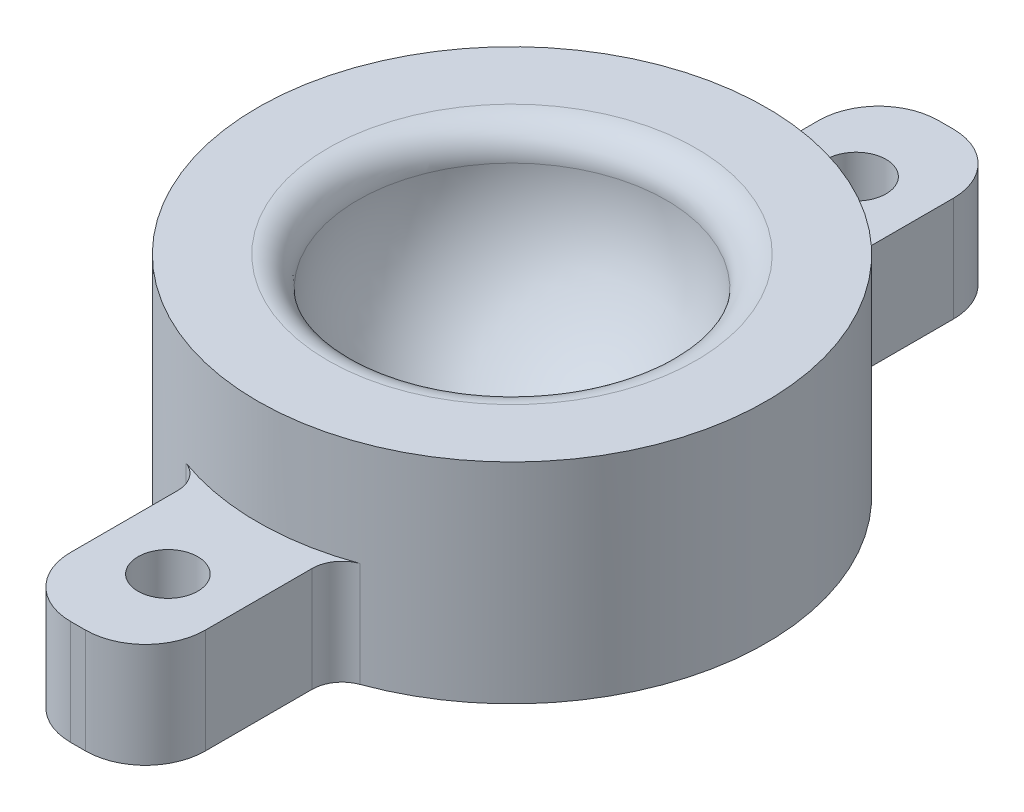
ISO-10303-21;
HEADER;
FILE_DESCRIPTION(('STEP AP214'),'2;1');
FILE_NAME('part.step','',(''),(''),'','','');
FILE_SCHEMA(('AUTOMOTIVE_DESIGN { 1 0 10303 214 1 1 1 1 }'));
ENDSEC;
DATA;
#1=APPLICATION_CONTEXT('core data for automotive mechanical design processes');
#2=APPLICATION_PROTOCOL_DEFINITION('international standard','automotive_design',2000,#1);
#3=PRODUCT_CONTEXT('',#1,'mechanical');
#4=PRODUCT('Part','Part','',(#3));
#5=PRODUCT_RELATED_PRODUCT_CATEGORY('part','',(#4));
#6=PRODUCT_DEFINITION_FORMATION('','',#4);
#7=PRODUCT_DEFINITION_CONTEXT('part definition',#1,'design');
#8=PRODUCT_DEFINITION('design','',#6,#7);
#9=PRODUCT_DEFINITION_SHAPE('','',#8);
#10=(LENGTH_UNIT() NAMED_UNIT(*) SI_UNIT(.MILLI.,.METRE.));
#11=(NAMED_UNIT(*) PLANE_ANGLE_UNIT() SI_UNIT($,.RADIAN.));
#12=(NAMED_UNIT(*) SI_UNIT($,.STERADIAN.) SOLID_ANGLE_UNIT());
#13=UNCERTAINTY_MEASURE_WITH_UNIT(LENGTH_MEASURE(1.E-05),#10,'distance_accuracy_value','');
#14=(GEOMETRIC_REPRESENTATION_CONTEXT(3) GLOBAL_UNCERTAINTY_ASSIGNED_CONTEXT((#13)) GLOBAL_UNIT_ASSIGNED_CONTEXT((#10,
#11,#12)) REPRESENTATION_CONTEXT('',''));
#15=CARTESIAN_POINT('',(0.,0.,0.));
#16=DIRECTION('',(0.,0.,1.));
#17=DIRECTION('',(1.,0.,0.));
#18=AXIS2_PLACEMENT_3D('',#15,#16,#17);
#19=CARTESIAN_POINT('',(0.,3.5,0.));
#20=DIRECTION('',(0.,1.,0.));
#21=DIRECTION('',(0.,0.,1.));
#22=AXIS2_PLACEMENT_3D('',#19,#20,#21);
#23=PLANE('',#22);
#24=CARTESIAN_POINT('',(0.,3.5,-11.5));
#25=DIRECTION('',(0.,1.,0.));
#26=DIRECTION('',(0.,0.,1.));
#27=AXIS2_PLACEMENT_3D('',#24,#25,#26);
#28=CIRCLE('',#27,1.);
#29=CARTESIAN_POINT('',(0.,3.5,-10.5));
#30=VERTEX_POINT('',#29);
#31=EDGE_CURVE('E202',#30,#30,#28,.T.);
#32=ORIENTED_EDGE('',*,*,#31,.F.);
#33=EDGE_LOOP('',(#32));
#34=FACE_BOUND('',#33,.T.);
#35=DIRECTION('',(0.,0.,-1.));
#36=VECTOR('',#35,1.);
#37=CARTESIAN_POINT('',(-2.25,3.5,0.));
#38=LINE('',#37,#36);
#39=CARTESIAN_POINT('',(-2.25,3.5,-8.92678553567856));
#40=VERTEX_POINT('',#39);
#41=CARTESIAN_POINT('',(-2.25,3.5,-12.5));
#42=VERTEX_POINT('',#41);
#43=EDGE_CURVE('E152',#40,#42,#38,.T.);
#44=ORIENTED_EDGE('',*,*,#43,.F.);
#45=CARTESIAN_POINT('',(-3.25,3.5,-8.92678553567856));
#46=DIRECTION('',(0.,1.,0.));
#47=DIRECTION('',(0.,0.,1.));
#48=AXIS2_PLACEMENT_3D('',#45,#46,#47);
#49=CIRCLE('',#48,1.);
#50=CARTESIAN_POINT('',(-2.90789473684211,3.5,-7.98712390034398));
#51=VERTEX_POINT('',#50);
#52=EDGE_CURVE('E289',#40,#51,#49,.F.);
#53=ORIENTED_EDGE('',*,*,#52,.T.);
#54=CARTESIAN_POINT('',(0.,3.5,0.));
#55=DIRECTION('',(0.,1.,0.));
#56=DIRECTION('',(0.,0.,1.));
#57=AXIS2_PLACEMENT_3D('',#54,#55,#56);
#58=CIRCLE('',#57,8.5);
#59=CARTESIAN_POINT('',(2.90789473684211,3.5,-7.98712390034398));
#60=VERTEX_POINT('',#59);
#61=EDGE_CURVE('E211',#51,#60,#58,.F.);
#62=ORIENTED_EDGE('',*,*,#61,.T.);
#63=CARTESIAN_POINT('',(3.25,3.5,-8.92678553567856));
#64=DIRECTION('',(0.,1.,0.));
#65=DIRECTION('',(0.,0.,1.));
#66=AXIS2_PLACEMENT_3D('',#63,#64,#65);
#67=CIRCLE('',#66,1.);
#68=CARTESIAN_POINT('',(2.25,3.5,-8.92678553567856));
#69=VERTEX_POINT('',#68);
#70=EDGE_CURVE('E277',#60,#69,#67,.F.);
#71=ORIENTED_EDGE('',*,*,#70,.T.);
#72=DIRECTION('',(0.,0.,1.));
#73=VECTOR('',#72,1.);
#74=CARTESIAN_POINT('',(2.25,3.5,0.));
#75=LINE('',#74,#73);
#76=CARTESIAN_POINT('',(2.25,3.5,-12.5));
#77=VERTEX_POINT('',#76);
#78=EDGE_CURVE('E195',#77,#69,#75,.T.);
#79=ORIENTED_EDGE('',*,*,#78,.F.);
#80=CARTESIAN_POINT('',(0.25,3.5,-12.5));
#81=DIRECTION('',(0.,1.,0.));
#82=DIRECTION('',(0.,0.,1.));
#83=AXIS2_PLACEMENT_3D('',#80,#81,#82);
#84=CIRCLE('',#83,2.);
#85=CARTESIAN_POINT('',(0.249999999999985,3.5,-14.5));
#86=VERTEX_POINT('',#85);
#87=EDGE_CURVE('E198',#86,#77,#84,.F.);
#88=ORIENTED_EDGE('',*,*,#87,.F.);
#89=DIRECTION('',(1.,0.,0.));
#90=VECTOR('',#89,1.);
#91=CARTESIAN_POINT('',(0.,3.5,-14.5));
#92=LINE('',#91,#90);
#93=CARTESIAN_POINT('',(-0.249999999999985,3.5,-14.5));
#94=VERTEX_POINT('',#93);
#95=EDGE_CURVE('E175',#94,#86,#92,.T.);
#96=ORIENTED_EDGE('',*,*,#95,.F.);
#97=CARTESIAN_POINT('',(-0.25,3.5,-12.5));
#98=DIRECTION('',(0.,1.,0.));
#99=DIRECTION('',(0.,0.,1.));
#100=AXIS2_PLACEMENT_3D('',#97,#98,#99);
#101=CIRCLE('',#100,2.);
#102=EDGE_CURVE('E162',#42,#94,#101,.F.);
#103=ORIENTED_EDGE('',*,*,#102,.F.);
#104=EDGE_LOOP('',(#44,#53,#62,#71,#79,#88,#96,#103));
#105=FACE_BOUND('',#104,.T.);
#106=ADVANCED_FACE('F41',(#34,#105),#23,.T.);
#107=CARTESIAN_POINT('',(-0.25,3.5,-12.5));
#108=DIRECTION('',(0.,-1.,0.));
#109=DIRECTION('',(0.,0.,-1.));
#110=AXIS2_PLACEMENT_3D('',#107,#108,#109);
#111=CYLINDRICAL_SURFACE('',#110,2.);
#112=CARTESIAN_POINT('',(-0.25,0.,-12.5));
#113=DIRECTION('',(0.,1.,0.));
#114=DIRECTION('',(0.,0.,1.));
#115=AXIS2_PLACEMENT_3D('',#112,#113,#114);
#116=CIRCLE('',#115,2.);
#117=CARTESIAN_POINT('',(-2.25,0.,-12.5));
#118=VERTEX_POINT('',#117);
#119=CARTESIAN_POINT('',(-0.249999999999985,0.,-14.5));
#120=VERTEX_POINT('',#119);
#121=EDGE_CURVE('E169',#118,#120,#116,.F.);
#122=ORIENTED_EDGE('',*,*,#121,.F.);
#123=DIRECTION('',(0.,-1.,0.));
#124=VECTOR('',#123,1.);
#125=CARTESIAN_POINT('',(-2.25,3.5,-12.5));
#126=LINE('',#125,#124);
#127=EDGE_CURVE('E155',#42,#118,#126,.T.);
#128=ORIENTED_EDGE('',*,*,#127,.F.);
#129=ORIENTED_EDGE('',*,*,#102,.T.);
#130=DIRECTION('',(0.,-1.,0.));
#131=VECTOR('',#130,1.);
#132=CARTESIAN_POINT('',(-0.249999999999985,3.5,-14.5));
#133=LINE('',#132,#131);
#134=EDGE_CURVE('E208',#94,#120,#133,.T.);
#135=ORIENTED_EDGE('',*,*,#134,.T.);
#136=EDGE_LOOP('',(#122,#128,#129,#135));
#137=FACE_BOUND('',#136,.T.);
#138=ADVANCED_FACE('F166',(#137),#111,.T.);
#139=CARTESIAN_POINT('',(-2.25,3.5,0.));
#140=DIRECTION('',(-1.,0.,0.));
#141=DIRECTION('',(0.,0.,1.));
#142=AXIS2_PLACEMENT_3D('',#139,#140,#141);
#143=PLANE('',#142);
#144=DIRECTION('',(0.,0.,-1.));
#145=VECTOR('',#144,1.);
#146=CARTESIAN_POINT('',(-2.25,0.,0.));
#147=LINE('',#146,#145);
#148=CARTESIAN_POINT('',(-2.25,0.,-8.92678553567856));
#149=VERTEX_POINT('',#148);
#150=EDGE_CURVE('E210',#149,#118,#147,.T.);
#151=ORIENTED_EDGE('',*,*,#150,.F.);
#152=DIRECTION('',(0.,-1.,0.));
#153=VECTOR('',#152,1.);
#154=CARTESIAN_POINT('',(-2.25,3.5,-8.92678553567856));
#155=LINE('',#154,#153);
#156=EDGE_CURVE('E56',#149,#40,#155,.F.);
#157=ORIENTED_EDGE('',*,*,#156,.T.);
#158=ORIENTED_EDGE('',*,*,#43,.T.);
#159=ORIENTED_EDGE('',*,*,#127,.T.);
#160=EDGE_LOOP('',(#151,#157,#158,#159));
#161=FACE_BOUND('',#160,.T.);
#162=ADVANCED_FACE('F154',(#161),#143,.T.);
#163=CARTESIAN_POINT('',(-2.25,3.5,0.));
#164=DIRECTION('',(1.,0.,0.));
#165=DIRECTION('',(0.,0.,-1.));
#166=AXIS2_PLACEMENT_3D('',#163,#164,#165);
#167=PLANE('',#166);
#168=DIRECTION('',(0.,0.,1.));
#169=VECTOR('',#168,1.);
#170=CARTESIAN_POINT('',(-2.25,3.5,0.));
#171=LINE('',#170,#169);
#172=CARTESIAN_POINT('',(-2.25,3.5,8.92678553567856));
#173=VERTEX_POINT('',#172);
#174=CARTESIAN_POINT('',(-2.25,3.5,12.5));
#175=VERTEX_POINT('',#174);
#176=EDGE_CURVE('E161',#173,#175,#171,.T.);
#177=ORIENTED_EDGE('',*,*,#176,.F.);
#178=DIRECTION('',(0.,1.,0.));
#179=VECTOR('',#178,1.);
#180=CARTESIAN_POINT('',(-2.25,0.,8.92678553567856));
#181=LINE('',#180,#179);
#182=CARTESIAN_POINT('',(-2.25,0.,8.92678553567856));
#183=VERTEX_POINT('',#182);
#184=EDGE_CURVE('E271',#173,#183,#181,.F.);
#185=ORIENTED_EDGE('',*,*,#184,.T.);
#186=DIRECTION('',(0.,0.,1.));
#187=VECTOR('',#186,1.);
#188=CARTESIAN_POINT('',(-2.25,0.,0.));
#189=LINE('',#188,#187);
#190=CARTESIAN_POINT('',(-2.25,0.,12.5));
#191=VERTEX_POINT('',#190);
#192=EDGE_CURVE('E216',#183,#191,#189,.T.);
#193=ORIENTED_EDGE('',*,*,#192,.T.);
#194=DIRECTION('',(0.,-1.,0.));
#195=VECTOR('',#194,1.);
#196=CARTESIAN_POINT('',(-2.25,3.5,12.5));
#197=LINE('',#196,#195);
#198=EDGE_CURVE('E171',#175,#191,#197,.T.);
#199=ORIENTED_EDGE('',*,*,#198,.F.);
#200=EDGE_LOOP('',(#177,#185,#193,#199));
#201=FACE_BOUND('',#200,.T.);
#202=ADVANCED_FACE('F374',(#201),#167,.F.);
#203=CARTESIAN_POINT('',(-0.25,3.5,12.5));
#204=DIRECTION('',(0.,-1.,0.));
#205=DIRECTION('',(0.,0.,-1.));
#206=AXIS2_PLACEMENT_3D('',#203,#204,#205);
#207=CYLINDRICAL_SURFACE('',#206,2.);
#208=CARTESIAN_POINT('',(-0.25,0.,12.5));
#209=DIRECTION('',(0.,1.,0.));
#210=DIRECTION('',(0.,0.,1.));
#211=AXIS2_PLACEMENT_3D('',#208,#209,#210);
#212=CIRCLE('',#211,2.);
#213=CARTESIAN_POINT('',(-0.249999999999985,0.,14.5));
#214=VERTEX_POINT('',#213);
#215=EDGE_CURVE('E219',#191,#214,#212,.T.);
#216=ORIENTED_EDGE('',*,*,#215,.T.);
#217=DIRECTION('',(0.,-1.,0.));
#218=VECTOR('',#217,1.);
#219=CARTESIAN_POINT('',(-0.249999999999985,3.5,14.5));
#220=LINE('',#219,#218);
#221=CARTESIAN_POINT('',(-0.249999999999985,3.5,14.5));
#222=VERTEX_POINT('',#221);
#223=EDGE_CURVE('E250',#222,#214,#220,.T.);
#224=ORIENTED_EDGE('',*,*,#223,.F.);
#225=CARTESIAN_POINT('',(-0.25,3.5,12.5));
#226=DIRECTION('',(0.,1.,0.));
#227=DIRECTION('',(0.,0.,1.));
#228=AXIS2_PLACEMENT_3D('',#225,#226,#227);
#229=CIRCLE('',#228,2.);
#230=EDGE_CURVE('E186',#175,#222,#229,.T.);
#231=ORIENTED_EDGE('',*,*,#230,.F.);
#232=ORIENTED_EDGE('',*,*,#198,.T.);
#233=EDGE_LOOP('',(#216,#224,#231,#232));
#234=FACE_BOUND('',#233,.T.);
#235=ADVANCED_FACE('F370',(#234),#207,.T.);
#236=CARTESIAN_POINT('',(0.,3.5,14.5));
#237=DIRECTION('',(0.,0.,-1.));
#238=DIRECTION('',(-1.,0.,0.));
#239=AXIS2_PLACEMENT_3D('',#236,#237,#238);
#240=PLANE('',#239);
#241=DIRECTION('',(1.,0.,0.));
#242=VECTOR('',#241,1.);
#243=CARTESIAN_POINT('',(0.,0.,14.5));
#244=LINE('',#243,#242);
#245=CARTESIAN_POINT('',(0.249999999999985,0.,14.5));
#246=VERTEX_POINT('',#245);
#247=EDGE_CURVE('E221',#214,#246,#244,.T.);
#248=ORIENTED_EDGE('',*,*,#247,.T.);
#249=DIRECTION('',(0.,-1.,0.));
#250=VECTOR('',#249,1.);
#251=CARTESIAN_POINT('',(0.249999999999985,3.5,14.5));
#252=LINE('',#251,#250);
#253=CARTESIAN_POINT('',(0.249999999999985,3.5,14.5));
#254=VERTEX_POINT('',#253);
#255=EDGE_CURVE('E247',#254,#246,#252,.T.);
#256=ORIENTED_EDGE('',*,*,#255,.F.);
#257=DIRECTION('',(1.,0.,0.));
#258=VECTOR('',#257,1.);
#259=CARTESIAN_POINT('',(0.,3.5,14.5));
#260=LINE('',#259,#258);
#261=EDGE_CURVE('E188',#222,#254,#260,.T.);
#262=ORIENTED_EDGE('',*,*,#261,.F.);
#263=ORIENTED_EDGE('',*,*,#223,.T.);
#264=EDGE_LOOP('',(#248,#256,#262,#263));
#265=FACE_BOUND('',#264,.T.);
#266=ADVANCED_FACE('F366',(#265),#240,.F.);
#267=CARTESIAN_POINT('',(0.25,3.5,12.5));
#268=DIRECTION('',(0.,-1.,0.));
#269=DIRECTION('',(0.,0.,-1.));
#270=AXIS2_PLACEMENT_3D('',#267,#268,#269);
#271=CYLINDRICAL_SURFACE('',#270,2.);
#272=CARTESIAN_POINT('',(0.25,0.,12.5));
#273=DIRECTION('',(0.,1.,0.));
#274=DIRECTION('',(0.,0.,1.));
#275=AXIS2_PLACEMENT_3D('',#272,#273,#274);
#276=CIRCLE('',#275,2.);
#277=CARTESIAN_POINT('',(2.25,0.,12.5));
#278=VERTEX_POINT('',#277);
#279=EDGE_CURVE('E223',#246,#278,#276,.T.);
#280=ORIENTED_EDGE('',*,*,#279,.T.);
#281=DIRECTION('',(0.,-1.,0.));
#282=VECTOR('',#281,1.);
#283=CARTESIAN_POINT('',(2.25,3.5,12.5));
#284=LINE('',#283,#282);
#285=CARTESIAN_POINT('',(2.25,3.5,12.5));
#286=VERTEX_POINT('',#285);
#287=EDGE_CURVE('E244',#286,#278,#284,.T.);
#288=ORIENTED_EDGE('',*,*,#287,.F.);
#289=CARTESIAN_POINT('',(0.25,3.5,12.5));
#290=DIRECTION('',(0.,1.,0.));
#291=DIRECTION('',(0.,0.,1.));
#292=AXIS2_PLACEMENT_3D('',#289,#290,#291);
#293=CIRCLE('',#292,2.);
#294=EDGE_CURVE('E190',#254,#286,#293,.T.);
#295=ORIENTED_EDGE('',*,*,#294,.F.);
#296=ORIENTED_EDGE('',*,*,#255,.T.);
#297=EDGE_LOOP('',(#280,#288,#295,#296));
#298=FACE_BOUND('',#297,.T.);
#299=ADVANCED_FACE('F362',(#298),#271,.T.);
#300=CARTESIAN_POINT('',(2.25,3.5,0.));
#301=DIRECTION('',(-1.,0.,0.));
#302=DIRECTION('',(0.,0.,1.));
#303=AXIS2_PLACEMENT_3D('',#300,#301,#302);
#304=PLANE('',#303);
#305=DIRECTION('',(0.,0.,-1.));
#306=VECTOR('',#305,1.);
#307=CARTESIAN_POINT('',(2.25,0.,0.));
#308=LINE('',#307,#306);
#309=CARTESIAN_POINT('',(2.25,0.,8.92678553567856));
#310=VERTEX_POINT('',#309);
#311=EDGE_CURVE('E225',#278,#310,#308,.T.);
#312=ORIENTED_EDGE('',*,*,#311,.T.);
#313=DIRECTION('',(0.,1.,0.));
#314=VECTOR('',#313,1.);
#315=CARTESIAN_POINT('',(2.25,3.5,8.92678553567856));
#316=LINE('',#315,#314);
#317=CARTESIAN_POINT('',(2.25,3.5,8.92678553567856));
#318=VERTEX_POINT('',#317);
#319=EDGE_CURVE('E269',#310,#318,#316,.T.);
#320=ORIENTED_EDGE('',*,*,#319,.T.);
#321=DIRECTION('',(0.,0.,-1.));
#322=VECTOR('',#321,1.);
#323=CARTESIAN_POINT('',(2.25,3.5,0.));
#324=LINE('',#323,#322);
#325=EDGE_CURVE('E192',#286,#318,#324,.T.);
#326=ORIENTED_EDGE('',*,*,#325,.F.);
#327=ORIENTED_EDGE('',*,*,#287,.T.);
#328=EDGE_LOOP('',(#312,#320,#326,#327));
#329=FACE_BOUND('',#328,.T.);
#330=ADVANCED_FACE('F358',(#329),#304,.F.);
#331=CARTESIAN_POINT('',(0.,3.5,0.));
#332=DIRECTION('',(0.,-1.,0.));
#333=DIRECTION('',(0.,0.,-1.));
#334=AXIS2_PLACEMENT_3D('',#331,#332,#333);
#335=CYLINDRICAL_SURFACE('',#334,8.5);
#336=CARTESIAN_POINT('',(0.,0.,0.));
#337=DIRECTION('',(0.,1.,0.));
#338=DIRECTION('',(0.,0.,1.));
#339=AXIS2_PLACEMENT_3D('',#336,#337,#338);
#340=CIRCLE('',#339,8.5);
#341=CARTESIAN_POINT('',(2.90789473684211,0.,7.98712390034398));
#342=VERTEX_POINT('',#341);
#343=CARTESIAN_POINT('',(2.90789473684211,0.,-7.98712390034398));
#344=VERTEX_POINT('',#343);
#345=EDGE_CURVE('E217',#342,#344,#340,.T.);
#346=ORIENTED_EDGE('',*,*,#345,.T.);
#347=DIRECTION('',(0.,-1.,0.));
#348=VECTOR('',#347,1.);
#349=CARTESIAN_POINT('',(2.90789473684211,3.5,-7.98712390034398));
#350=LINE('',#349,#348);
#351=EDGE_CURVE('E266',#344,#60,#350,.F.);
#352=ORIENTED_EDGE('',*,*,#351,.T.);
#353=ORIENTED_EDGE('',*,*,#61,.F.);
#354=DIRECTION('',(0.,-1.,0.));
#355=VECTOR('',#354,1.);
#356=CARTESIAN_POINT('',(-2.90789473684211,3.5,-7.98712390034398));
#357=LINE('',#356,#355);
#358=CARTESIAN_POINT('',(-2.90789473684211,0.,-7.98712390034398));
#359=VERTEX_POINT('',#358);
#360=EDGE_CURVE('E257',#51,#359,#357,.T.);
#361=ORIENTED_EDGE('',*,*,#360,.T.);
#362=CARTESIAN_POINT('',(-2.90789473684211,0.,7.98712390034398));
#363=VERTEX_POINT('',#362);
#364=EDGE_CURVE('E213',#359,#363,#340,.T.);
#365=ORIENTED_EDGE('',*,*,#364,.T.);
#366=DIRECTION('',(0.,-1.,0.));
#367=VECTOR('',#366,1.);
#368=CARTESIAN_POINT('',(-2.90789473684211,3.5,7.98712390034398));
#369=LINE('',#368,#367);
#370=CARTESIAN_POINT('',(-2.90789473684211,3.5,7.98712390034398));
#371=VERTEX_POINT('',#370);
#372=EDGE_CURVE('E260',#363,#371,#369,.F.);
#373=ORIENTED_EDGE('',*,*,#372,.T.);
#374=CARTESIAN_POINT('',(2.90789473684211,3.5,7.98712390034398));
#375=VERTEX_POINT('',#374);
#376=EDGE_CURVE('E182',#375,#371,#58,.F.);
#377=ORIENTED_EDGE('',*,*,#376,.F.);
#378=DIRECTION('',(0.,-1.,0.));
#379=VECTOR('',#378,1.);
#380=CARTESIAN_POINT('',(2.90789473684211,3.5,7.98712390034398));
#381=LINE('',#380,#379);
#382=EDGE_CURVE('E263',#375,#342,#381,.T.);
#383=ORIENTED_EDGE('',*,*,#382,.T.);
#384=EDGE_LOOP('',(#346,#352,#353,#361,#365,#373,#377,#383));
#385=FACE_BOUND('',#384,.T.);
#386=CARTESIAN_POINT('',(0.,7.,0.));
#387=DIRECTION('',(0.,1.,0.));
#388=DIRECTION('',(0.,0.,1.));
#389=AXIS2_PLACEMENT_3D('',#386,#387,#388);
#390=CIRCLE('',#389,8.5);
#391=CARTESIAN_POINT('',(0.,7.,8.5));
#392=VERTEX_POINT('',#391);
#393=EDGE_CURVE('E415',#392,#392,#390,.T.);
#394=ORIENTED_EDGE('',*,*,#393,.F.);
#395=EDGE_LOOP('',(#394));
#396=FACE_BOUND('',#395,.T.);
#397=ADVANCED_FACE('F354',(#385,#396),#335,.T.);
#398=CARTESIAN_POINT('',(2.25,3.5,0.));
#399=DIRECTION('',(1.,0.,0.));
#400=DIRECTION('',(0.,0.,-1.));
#401=AXIS2_PLACEMENT_3D('',#398,#399,#400);
#402=PLANE('',#401);
#403=ORIENTED_EDGE('',*,*,#78,.T.);
#404=DIRECTION('',(0.,-1.,0.));
#405=VECTOR('',#404,1.);
#406=CARTESIAN_POINT('',(2.25,3.5,-8.92678553567856));
#407=LINE('',#406,#405);
#408=CARTESIAN_POINT('',(2.25,0.,-8.92678553567856));
#409=VERTEX_POINT('',#408);
#410=EDGE_CURVE('E170',#69,#409,#407,.T.);
#411=ORIENTED_EDGE('',*,*,#410,.T.);
#412=DIRECTION('',(0.,0.,1.));
#413=VECTOR('',#412,1.);
#414=CARTESIAN_POINT('',(2.25,0.,0.));
#415=LINE('',#414,#413);
#416=CARTESIAN_POINT('',(2.25,0.,-12.5));
#417=VERTEX_POINT('',#416);
#418=EDGE_CURVE('E228',#417,#409,#415,.T.);
#419=ORIENTED_EDGE('',*,*,#418,.F.);
#420=DIRECTION('',(0.,-1.,0.));
#421=VECTOR('',#420,1.);
#422=CARTESIAN_POINT('',(2.25,3.5,-12.5));
#423=LINE('',#422,#421);
#424=EDGE_CURVE('E242',#77,#417,#423,.T.);
#425=ORIENTED_EDGE('',*,*,#424,.F.);
#426=EDGE_LOOP('',(#403,#411,#419,#425));
#427=FACE_BOUND('',#426,.T.);
#428=ADVANCED_FACE('F349',(#427),#402,.T.);
#429=CARTESIAN_POINT('',(0.25,3.5,-12.5));
#430=DIRECTION('',(0.,-1.,0.));
#431=DIRECTION('',(0.,0.,-1.));
#432=AXIS2_PLACEMENT_3D('',#429,#430,#431);
#433=CYLINDRICAL_SURFACE('',#432,2.);
#434=CARTESIAN_POINT('',(0.25,0.,-12.5));
#435=DIRECTION('',(0.,1.,0.));
#436=DIRECTION('',(0.,0.,1.));
#437=AXIS2_PLACEMENT_3D('',#434,#435,#436);
#438=CIRCLE('',#437,2.);
#439=CARTESIAN_POINT('',(0.249999999999985,0.,-14.5));
#440=VERTEX_POINT('',#439);
#441=EDGE_CURVE('E231',#440,#417,#438,.F.);
#442=ORIENTED_EDGE('',*,*,#441,.F.);
#443=DIRECTION('',(0.,-1.,0.));
#444=VECTOR('',#443,1.);
#445=CARTESIAN_POINT('',(0.249999999999985,3.5,-14.5));
#446=LINE('',#445,#444);
#447=EDGE_CURVE('E240',#86,#440,#446,.T.);
#448=ORIENTED_EDGE('',*,*,#447,.F.);
#449=ORIENTED_EDGE('',*,*,#87,.T.);
#450=ORIENTED_EDGE('',*,*,#424,.T.);
#451=EDGE_LOOP('',(#442,#448,#449,#450));
#452=FACE_BOUND('',#451,.T.);
#453=ADVANCED_FACE('F340',(#452),#433,.T.);
#454=CARTESIAN_POINT('',(0.,3.5,-11.5));
#455=DIRECTION('',(0.,-1.,0.));
#456=DIRECTION('',(0.,0.,-1.));
#457=AXIS2_PLACEMENT_3D('',#454,#455,#456);
#458=CYLINDRICAL_SURFACE('',#457,1.);
#459=ORIENTED_EDGE('',*,*,#31,.T.);
#460=EDGE_LOOP('',(#459));
#461=FACE_BOUND('',#460,.T.);
#462=CARTESIAN_POINT('',(0.,0.,-11.5));
#463=DIRECTION('',(0.,1.,0.));
#464=DIRECTION('',(0.,0.,1.));
#465=AXIS2_PLACEMENT_3D('',#462,#463,#464);
#466=CIRCLE('',#465,1.);
#467=CARTESIAN_POINT('',(0.,0.,-10.5));
#468=VERTEX_POINT('',#467);
#469=EDGE_CURVE('E179',#468,#468,#466,.T.);
#470=ORIENTED_EDGE('',*,*,#469,.F.);
#471=EDGE_LOOP('',(#470));
#472=FACE_BOUND('',#471,.T.);
#473=ADVANCED_FACE('F338',(#461,#472),#458,.F.);
#474=CARTESIAN_POINT('',(0.,3.5,-14.5));
#475=DIRECTION('',(0.,0.,-1.));
#476=DIRECTION('',(-1.,0.,0.));
#477=AXIS2_PLACEMENT_3D('',#474,#475,#476);
#478=PLANE('',#477);
#479=DIRECTION('',(1.,0.,0.));
#480=VECTOR('',#479,1.);
#481=CARTESIAN_POINT('',(0.,0.,-14.5));
#482=LINE('',#481,#480);
#483=EDGE_CURVE('E234',#120,#440,#482,.T.);
#484=ORIENTED_EDGE('',*,*,#483,.F.);
#485=ORIENTED_EDGE('',*,*,#134,.F.);
#486=ORIENTED_EDGE('',*,*,#95,.T.);
#487=ORIENTED_EDGE('',*,*,#447,.T.);
#488=EDGE_LOOP('',(#484,#485,#486,#487));
#489=FACE_BOUND('',#488,.T.);
#490=ADVANCED_FACE('F325',(#489),#478,.T.);
#491=CARTESIAN_POINT('',(0.,3.5,11.5));
#492=DIRECTION('',(0.,-1.,0.));
#493=DIRECTION('',(0.,0.,-1.));
#494=AXIS2_PLACEMENT_3D('',#491,#492,#493);
#495=CYLINDRICAL_SURFACE('',#494,1.);
#496=CARTESIAN_POINT('',(0.,3.5,11.5));
#497=DIRECTION('',(0.,1.,0.));
#498=DIRECTION('',(0.,0.,1.));
#499=AXIS2_PLACEMENT_3D('',#496,#497,#498);
#500=CIRCLE('',#499,1.);
#501=CARTESIAN_POINT('',(0.,3.5,12.5));
#502=VERTEX_POINT('',#501);
#503=EDGE_CURVE('E205',#502,#502,#500,.F.);
#504=ORIENTED_EDGE('',*,*,#503,.F.);
#505=EDGE_LOOP('',(#504));
#506=FACE_BOUND('',#505,.T.);
#507=CARTESIAN_POINT('',(0.,0.,11.5));
#508=DIRECTION('',(0.,1.,0.));
#509=DIRECTION('',(0.,0.,1.));
#510=AXIS2_PLACEMENT_3D('',#507,#508,#509);
#511=CIRCLE('',#510,1.);
#512=CARTESIAN_POINT('',(0.,0.,12.5));
#513=VERTEX_POINT('',#512);
#514=EDGE_CURVE('E176',#513,#513,#511,.F.);
#515=ORIENTED_EDGE('',*,*,#514,.T.);
#516=EDGE_LOOP('',(#515));
#517=FACE_BOUND('',#516,.T.);
#518=ADVANCED_FACE('F318',(#506,#517),#495,.F.);
#519=ORIENTED_EDGE('',*,*,#325,.T.);
#520=CARTESIAN_POINT('',(3.25,3.5,8.92678553567856));
#521=DIRECTION('',(0.,1.,0.));
#522=DIRECTION('',(0.,0.,1.));
#523=AXIS2_PLACEMENT_3D('',#520,#521,#522);
#524=CIRCLE('',#523,1.);
#525=EDGE_CURVE('E281',#318,#375,#524,.F.);
#526=ORIENTED_EDGE('',*,*,#525,.T.);
#527=ORIENTED_EDGE('',*,*,#376,.T.);
#528=CARTESIAN_POINT('',(-3.25,3.5,8.92678553567856));
#529=DIRECTION('',(0.,1.,0.));
#530=DIRECTION('',(0.,0.,1.));
#531=AXIS2_PLACEMENT_3D('',#528,#529,#530);
#532=CIRCLE('',#531,1.);
#533=EDGE_CURVE('E286',#371,#173,#532,.F.);
#534=ORIENTED_EDGE('',*,*,#533,.T.);
#535=ORIENTED_EDGE('',*,*,#176,.T.);
#536=ORIENTED_EDGE('',*,*,#230,.T.);
#537=ORIENTED_EDGE('',*,*,#261,.T.);
#538=ORIENTED_EDGE('',*,*,#294,.T.);
#539=EDGE_LOOP('',(#519,#526,#527,#534,#535,#536,#537,#538));
#540=FACE_BOUND('',#539,.T.);
#541=ORIENTED_EDGE('',*,*,#503,.T.);
#542=EDGE_LOOP('',(#541));
#543=FACE_BOUND('',#542,.T.);
#544=ADVANCED_FACE('F306',(#540,#543),#23,.T.);
#545=CARTESIAN_POINT('',(0.,0.,0.));
#546=DIRECTION('',(0.,1.,0.));
#547=DIRECTION('',(0.,0.,1.));
#548=AXIS2_PLACEMENT_3D('',#545,#546,#547);
#549=PLANE('',#548);
#550=ORIENTED_EDGE('',*,*,#192,.F.);
#551=CARTESIAN_POINT('',(-3.25,0.,8.92678553567856));
#552=DIRECTION('',(0.,1.,0.));
#553=DIRECTION('',(0.,0.,1.));
#554=AXIS2_PLACEMENT_3D('',#551,#552,#553);
#555=CIRCLE('',#554,1.);
#556=EDGE_CURVE('E284',#183,#363,#555,.T.);
#557=ORIENTED_EDGE('',*,*,#556,.T.);
#558=ORIENTED_EDGE('',*,*,#364,.F.);
#559=CARTESIAN_POINT('',(-3.25,0.,-8.92678553567856));
#560=DIRECTION('',(0.,1.,0.));
#561=DIRECTION('',(0.,0.,1.));
#562=AXIS2_PLACEMENT_3D('',#559,#560,#561);
#563=CIRCLE('',#562,1.);
#564=EDGE_CURVE('E64',#359,#149,#563,.T.);
#565=ORIENTED_EDGE('',*,*,#564,.T.);
#566=ORIENTED_EDGE('',*,*,#150,.T.);
#567=ORIENTED_EDGE('',*,*,#121,.T.);
#568=ORIENTED_EDGE('',*,*,#483,.T.);
#569=ORIENTED_EDGE('',*,*,#441,.T.);
#570=ORIENTED_EDGE('',*,*,#418,.T.);
#571=CARTESIAN_POINT('',(3.25,0.,-8.92678553567856));
#572=DIRECTION('',(0.,1.,0.));
#573=DIRECTION('',(0.,0.,1.));
#574=AXIS2_PLACEMENT_3D('',#571,#572,#573);
#575=CIRCLE('',#574,1.);
#576=EDGE_CURVE('E275',#409,#344,#575,.T.);
#577=ORIENTED_EDGE('',*,*,#576,.T.);
#578=ORIENTED_EDGE('',*,*,#345,.F.);
#579=CARTESIAN_POINT('',(3.25,0.,8.92678553567856));
#580=DIRECTION('',(0.,1.,0.));
#581=DIRECTION('',(0.,0.,1.));
#582=AXIS2_PLACEMENT_3D('',#579,#580,#581);
#583=CIRCLE('',#582,1.);
#584=EDGE_CURVE('E279',#342,#310,#583,.T.);
#585=ORIENTED_EDGE('',*,*,#584,.T.);
#586=ORIENTED_EDGE('',*,*,#311,.F.);
#587=ORIENTED_EDGE('',*,*,#279,.F.);
#588=ORIENTED_EDGE('',*,*,#247,.F.);
#589=ORIENTED_EDGE('',*,*,#215,.F.);
#590=EDGE_LOOP('',(#550,#557,#558,#565,#566,#567,#568,#569,#570,#577,#578,#585,#586,#587,#588,#589));
#591=FACE_BOUND('',#590,.T.);
#592=ORIENTED_EDGE('',*,*,#514,.F.);
#593=EDGE_LOOP('',(#592));
#594=FACE_BOUND('',#593,.T.);
#595=ORIENTED_EDGE('',*,*,#469,.T.);
#596=EDGE_LOOP('',(#595));
#597=FACE_BOUND('',#596,.T.);
#598=ADVANCED_FACE('F317',(#591,#594,#597),#549,.F.);
#599=CARTESIAN_POINT('',(0.,7.,0.));
#600=DIRECTION('',(0.,1.,0.));
#601=DIRECTION('',(0.,0.,1.));
#602=AXIS2_PLACEMENT_3D('',#599,#600,#601);
#603=PLANE('',#602);
#604=CARTESIAN_POINT('',(0.,7.,0.));
#605=DIRECTION('',(0.,1.,0.));
#606=DIRECTION('',(0.,0.,1.));
#607=AXIS2_PLACEMENT_3D('',#604,#605,#606);
#608=CIRCLE('',#607,6.15);
#609=CARTESIAN_POINT('',(0.,7.,6.15));
#610=VERTEX_POINT('',#609);
#611=EDGE_CURVE('E11',#610,#610,#608,.F.);
#612=ORIENTED_EDGE('',*,*,#611,.T.);
#613=EDGE_LOOP('',(#612));
#614=FACE_BOUND('',#613,.T.);
#615=ORIENTED_EDGE('',*,*,#393,.T.);
#616=EDGE_LOOP('',(#615));
#617=FACE_BOUND('',#616,.T.);
#618=ADVANCED_FACE('F324',(#614,#617),#603,.T.);
#619=CARTESIAN_POINT('',(3.25,3.5,-8.92678553567856));
#620=DIRECTION('',(0.,-1.,0.));
#621=DIRECTION('',(0.,0.,-1.));
#622=AXIS2_PLACEMENT_3D('',#619,#620,#621);
#623=CYLINDRICAL_SURFACE('',#622,1.);
#624=ORIENTED_EDGE('',*,*,#70,.F.);
#625=ORIENTED_EDGE('',*,*,#351,.F.);
#626=ORIENTED_EDGE('',*,*,#576,.F.);
#627=ORIENTED_EDGE('',*,*,#410,.F.);
#628=EDGE_LOOP('',(#624,#625,#626,#627));
#629=FACE_BOUND('',#628,.T.);
#630=ADVANCED_FACE('F380',(#629),#623,.F.);
#631=CARTESIAN_POINT('',(3.25,3.5,8.92678553567856));
#632=DIRECTION('',(0.,-1.,0.));
#633=DIRECTION('',(0.,0.,-1.));
#634=AXIS2_PLACEMENT_3D('',#631,#632,#633);
#635=CYLINDRICAL_SURFACE('',#634,1.);
#636=ORIENTED_EDGE('',*,*,#525,.F.);
#637=ORIENTED_EDGE('',*,*,#319,.F.);
#638=ORIENTED_EDGE('',*,*,#584,.F.);
#639=ORIENTED_EDGE('',*,*,#382,.F.);
#640=EDGE_LOOP('',(#636,#637,#638,#639));
#641=FACE_BOUND('',#640,.T.);
#642=ADVANCED_FACE('F383',(#641),#635,.F.);
#643=CARTESIAN_POINT('',(-3.25,3.5,8.92678553567856));
#644=DIRECTION('',(0.,-1.,0.));
#645=DIRECTION('',(0.,0.,-1.));
#646=AXIS2_PLACEMENT_3D('',#643,#644,#645);
#647=CYLINDRICAL_SURFACE('',#646,1.);
#648=ORIENTED_EDGE('',*,*,#533,.F.);
#649=ORIENTED_EDGE('',*,*,#372,.F.);
#650=ORIENTED_EDGE('',*,*,#556,.F.);
#651=ORIENTED_EDGE('',*,*,#184,.F.);
#652=EDGE_LOOP('',(#648,#649,#650,#651));
#653=FACE_BOUND('',#652,.T.);
#654=ADVANCED_FACE('F387',(#653),#647,.F.);
#655=CARTESIAN_POINT('',(-3.25,3.5,-8.92678553567856));
#656=DIRECTION('',(0.,-1.,0.));
#657=DIRECTION('',(0.,0.,-1.));
#658=AXIS2_PLACEMENT_3D('',#655,#656,#657);
#659=CYLINDRICAL_SURFACE('',#658,1.);
#660=ORIENTED_EDGE('',*,*,#52,.F.);
#661=ORIENTED_EDGE('',*,*,#156,.F.);
#662=ORIENTED_EDGE('',*,*,#564,.F.);
#663=ORIENTED_EDGE('',*,*,#360,.F.);
#664=EDGE_LOOP('',(#660,#661,#662,#663));
#665=FACE_BOUND('',#664,.T.);
#666=ADVANCED_FACE('F300',(#665),#659,.F.);
#667=CARTESIAN_POINT('',(0.,6.,0.));
#668=DIRECTION('',(0.,1.,0.));
#669=DIRECTION('',(1.,0.,0.));
#670=AXIS2_PLACEMENT_3D('',#667,#668,#669);
#671=SPHERICAL_SURFACE('',#670,5.15);
#672=CARTESIAN_POINT('',(0.,6.,0.));
#673=DIRECTION('',(0.,1.,0.));
#674=DIRECTION('',(0.,0.,1.));
#675=AXIS2_PLACEMENT_3D('',#672,#673,#674);
#676=CIRCLE('',#675,5.15);
#677=CARTESIAN_POINT('',(0.,6.,5.15));
#678=VERTEX_POINT('',#677);
#679=EDGE_CURVE('E49',#678,#678,#676,.T.);
#680=ORIENTED_EDGE('',*,*,#679,.T.);
#681=EDGE_LOOP('',(#680));
#682=FACE_BOUND('',#681,.T.);
#683=ADVANCED_FACE('F293',(#682),#671,.F.);
#684=CARTESIAN_POINT('',(0.,6.,0.));
#685=DIRECTION('',(0.,1.,0.));
#686=DIRECTION('',(0.,0.,1.));
#687=AXIS2_PLACEMENT_3D('',#684,#685,#686);
#688=TOROIDAL_SURFACE('',#687,6.15,1.);
#689=ORIENTED_EDGE('',*,*,#611,.F.);
#690=EDGE_LOOP('',(#689));
#691=FACE_BOUND('',#690,.T.);
#692=ORIENTED_EDGE('',*,*,#679,.F.);
#693=EDGE_LOOP('',(#692));
#694=FACE_BOUND('',#693,.T.);
#695=ADVANCED_FACE('F43',(#691,#694),#688,.T.);
#696=CLOSED_SHELL('',(#106,#138,#162,#202,#235,#266,#299,#330,#397,#428,#453,#473,#490,#518,
#544,#598,#618,#630,#642,#654,#666,#683,#695));
#697=MANIFOLD_SOLID_BREP('B2',#696);
#698=ADVANCED_BREP_SHAPE_REPRESENTATION('',(#18,#697),#14);
#699=SHAPE_DEFINITION_REPRESENTATION(#9,#698);
ENDSEC;
END-ISO-10303-21;
